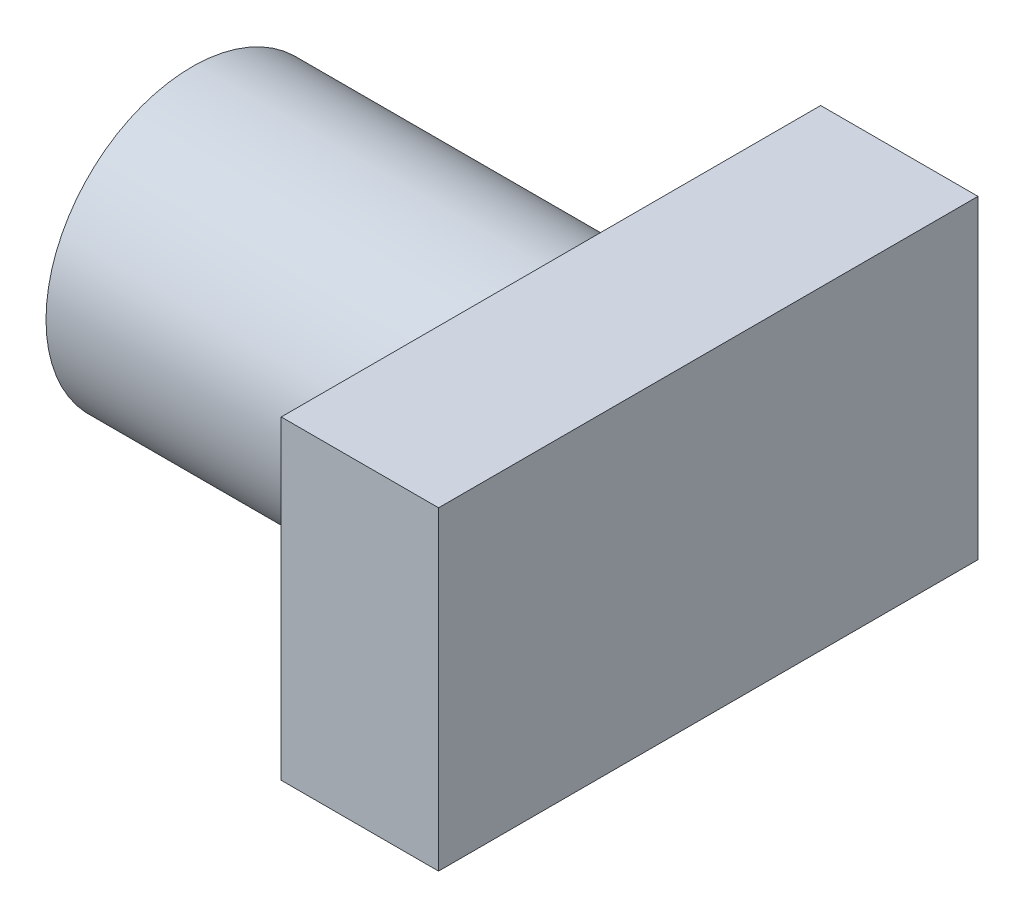
ISO-10303-21;
HEADER;
FILE_DESCRIPTION(('STEP AP214'),'2;1');
FILE_NAME('part.step','',(''),(''),'','','');
FILE_SCHEMA(('AUTOMOTIVE_DESIGN { 1 0 10303 214 1 1 1 1 }'));
ENDSEC;
DATA;
#1=APPLICATION_CONTEXT('core data for automotive mechanical design processes');
#2=APPLICATION_PROTOCOL_DEFINITION('international standard','automotive_design',2000,#1);
#3=PRODUCT_CONTEXT('',#1,'mechanical');
#4=PRODUCT('Part','Part','',(#3));
#5=PRODUCT_RELATED_PRODUCT_CATEGORY('part','',(#4));
#6=PRODUCT_DEFINITION_FORMATION('','',#4);
#7=PRODUCT_DEFINITION_CONTEXT('part definition',#1,'design');
#8=PRODUCT_DEFINITION('design','',#6,#7);
#9=PRODUCT_DEFINITION_SHAPE('','',#8);
#10=(LENGTH_UNIT() NAMED_UNIT(*) SI_UNIT(.MILLI.,.METRE.));
#11=(NAMED_UNIT(*) PLANE_ANGLE_UNIT() SI_UNIT($,.RADIAN.));
#12=(NAMED_UNIT(*) SI_UNIT($,.STERADIAN.) SOLID_ANGLE_UNIT());
#13=UNCERTAINTY_MEASURE_WITH_UNIT(LENGTH_MEASURE(1.E-05),#10,'distance_accuracy_value','');
#14=(GEOMETRIC_REPRESENTATION_CONTEXT(3) GLOBAL_UNCERTAINTY_ASSIGNED_CONTEXT((#13)) GLOBAL_UNIT_ASSIGNED_CONTEXT((#10,
#11,#12)) REPRESENTATION_CONTEXT('',''));
#15=CARTESIAN_POINT('',(0.,0.,0.));
#16=DIRECTION('',(0.,0.,1.));
#17=DIRECTION('',(1.,0.,0.));
#18=AXIS2_PLACEMENT_3D('',#15,#16,#17);
#19=CARTESIAN_POINT('',(0.,70.,0.));
#20=DIRECTION('',(0.,0.,-1.));
#21=DIRECTION('',(-1.,0.,0.));
#22=AXIS2_PLACEMENT_3D('',#19,#20,#21);
#23=PLANE('',#22);
#24=DIRECTION('',(1.,0.,0.));
#25=VECTOR('',#24,1.);
#26=CARTESIAN_POINT('',(0.,0.,0.));
#27=LINE('',#26,#25);
#28=CARTESIAN_POINT('',(0.,0.,0.));
#29=VERTEX_POINT('',#28);
#30=CARTESIAN_POINT('',(35.,0.,0.));
#31=VERTEX_POINT('',#30);
#32=EDGE_CURVE('E96',#29,#31,#27,.T.);
#33=ORIENTED_EDGE('',*,*,#32,.T.);
#34=DIRECTION('',(0.,-1.,0.));
#35=VECTOR('',#34,1.);
#36=CARTESIAN_POINT('',(35.,70.,0.));
#37=LINE('',#36,#35);
#38=CARTESIAN_POINT('',(35.,70.,0.));
#39=VERTEX_POINT('',#38);
#40=EDGE_CURVE('E11',#39,#31,#37,.T.);
#41=ORIENTED_EDGE('',*,*,#40,.F.);
#42=DIRECTION('',(1.,0.,0.));
#43=VECTOR('',#42,1.);
#44=CARTESIAN_POINT('',(0.,70.,0.));
#45=LINE('',#44,#43);
#46=CARTESIAN_POINT('',(0.,70.,0.));
#47=VERTEX_POINT('',#46);
#48=EDGE_CURVE('E82',#47,#39,#45,.T.);
#49=ORIENTED_EDGE('',*,*,#48,.F.);
#50=DIRECTION('',(0.,-1.,0.));
#51=VECTOR('',#50,1.);
#52=CARTESIAN_POINT('',(0.,70.,0.));
#53=LINE('',#52,#51);
#54=EDGE_CURVE('E49',#47,#29,#53,.T.);
#55=ORIENTED_EDGE('',*,*,#54,.T.);
#56=EDGE_LOOP('',(#33,#41,#49,#55));
#57=FACE_BOUND('',#56,.T.);
#58=ADVANCED_FACE('F33',(#57),#23,.F.);
#59=CARTESIAN_POINT('',(35.,70.,0.));
#60=DIRECTION('',(-1.,0.,0.));
#61=DIRECTION('',(0.,0.,1.));
#62=AXIS2_PLACEMENT_3D('',#59,#60,#61);
#63=PLANE('',#62);
#64=DIRECTION('',(0.,0.,-1.));
#65=VECTOR('',#64,1.);
#66=CARTESIAN_POINT('',(35.,0.,0.));
#67=LINE('',#66,#65);
#68=CARTESIAN_POINT('',(35.,0.,-120.));
#69=VERTEX_POINT('',#68);
#70=EDGE_CURVE('E87',#31,#69,#67,.T.);
#71=ORIENTED_EDGE('',*,*,#70,.T.);
#72=DIRECTION('',(0.,-1.,0.));
#73=VECTOR('',#72,1.);
#74=CARTESIAN_POINT('',(35.,70.,-120.));
#75=LINE('',#74,#73);
#76=CARTESIAN_POINT('',(35.,70.,-120.));
#77=VERTEX_POINT('',#76);
#78=EDGE_CURVE('E41',#77,#69,#75,.T.);
#79=ORIENTED_EDGE('',*,*,#78,.F.);
#80=DIRECTION('',(0.,0.,-1.));
#81=VECTOR('',#80,1.);
#82=CARTESIAN_POINT('',(35.,70.,0.));
#83=LINE('',#82,#81);
#84=EDGE_CURVE('E74',#39,#77,#83,.T.);
#85=ORIENTED_EDGE('',*,*,#84,.F.);
#86=ORIENTED_EDGE('',*,*,#40,.T.);
#87=EDGE_LOOP('',(#71,#79,#85,#86));
#88=FACE_BOUND('',#87,.T.);
#89=ADVANCED_FACE('F86',(#88),#63,.F.);
#90=CARTESIAN_POINT('',(0.,70.,-120.));
#91=DIRECTION('',(0.,0.,-1.));
#92=DIRECTION('',(-1.,0.,0.));
#93=AXIS2_PLACEMENT_3D('',#90,#91,#92);
#94=PLANE('',#93);
#95=DIRECTION('',(1.,0.,0.));
#96=VECTOR('',#95,1.);
#97=CARTESIAN_POINT('',(0.,0.,-120.));
#98=LINE('',#97,#96);
#99=CARTESIAN_POINT('',(0.,0.,-120.));
#100=VERTEX_POINT('',#99);
#101=EDGE_CURVE('E100',#100,#69,#98,.T.);
#102=ORIENTED_EDGE('',*,*,#101,.F.);
#103=DIRECTION('',(0.,-1.,0.));
#104=VECTOR('',#103,1.);
#105=CARTESIAN_POINT('',(0.,70.,-120.));
#106=LINE('',#105,#104);
#107=CARTESIAN_POINT('',(0.,70.,-120.));
#108=VERTEX_POINT('',#107);
#109=EDGE_CURVE('E63',#108,#100,#106,.T.);
#110=ORIENTED_EDGE('',*,*,#109,.F.);
#111=DIRECTION('',(1.,0.,0.));
#112=VECTOR('',#111,1.);
#113=CARTESIAN_POINT('',(0.,70.,-120.));
#114=LINE('',#113,#112);
#115=EDGE_CURVE('E81',#108,#77,#114,.T.);
#116=ORIENTED_EDGE('',*,*,#115,.T.);
#117=ORIENTED_EDGE('',*,*,#78,.T.);
#118=EDGE_LOOP('',(#102,#110,#116,#117));
#119=FACE_BOUND('',#118,.T.);
#120=ADVANCED_FACE('F90',(#119),#94,.T.);
#121=CARTESIAN_POINT('',(0.,70.,0.));
#122=DIRECTION('',(-1.,0.,0.));
#123=DIRECTION('',(0.,0.,1.));
#124=AXIS2_PLACEMENT_3D('',#121,#122,#123);
#125=PLANE('',#124);
#126=CARTESIAN_POINT('',(0.,34.8907926188389,-60.1749325689855));
#127=DIRECTION('',(-1.,0.,0.));
#128=DIRECTION('',(0.,0.,1.));
#129=AXIS2_PLACEMENT_3D('',#126,#127,#128);
#130=CIRCLE('',#129,32.5);
#131=CARTESIAN_POINT('',(0.,34.8907926188389,-27.6749325689855));
#132=VERTEX_POINT('',#131);
#133=EDGE_CURVE('E108',#132,#132,#130,.T.);
#134=ORIENTED_EDGE('',*,*,#133,.F.);
#135=EDGE_LOOP('',(#134));
#136=FACE_BOUND('',#135,.T.);
#137=DIRECTION('',(0.,0.,-1.));
#138=VECTOR('',#137,1.);
#139=CARTESIAN_POINT('',(0.,0.,0.));
#140=LINE('',#139,#138);
#141=EDGE_CURVE('E102',#29,#100,#140,.T.);
#142=ORIENTED_EDGE('',*,*,#141,.F.);
#143=ORIENTED_EDGE('',*,*,#54,.F.);
#144=DIRECTION('',(0.,0.,-1.));
#145=VECTOR('',#144,1.);
#146=CARTESIAN_POINT('',(0.,70.,0.));
#147=LINE('',#146,#145);
#148=EDGE_CURVE('E91',#47,#108,#147,.T.);
#149=ORIENTED_EDGE('',*,*,#148,.T.);
#150=ORIENTED_EDGE('',*,*,#109,.T.);
#151=EDGE_LOOP('',(#142,#143,#149,#150));
#152=FACE_BOUND('',#151,.T.);
#153=ADVANCED_FACE('F133',(#136,#152),#125,.T.);
#154=CARTESIAN_POINT('',(0.,70.,0.));
#155=DIRECTION('',(0.,1.,0.));
#156=DIRECTION('',(0.,0.,1.));
#157=AXIS2_PLACEMENT_3D('',#154,#155,#156);
#158=PLANE('',#157);
#159=ORIENTED_EDGE('',*,*,#48,.T.);
#160=ORIENTED_EDGE('',*,*,#84,.T.);
#161=ORIENTED_EDGE('',*,*,#115,.F.);
#162=ORIENTED_EDGE('',*,*,#148,.F.);
#163=EDGE_LOOP('',(#159,#160,#161,#162));
#164=FACE_BOUND('',#163,.T.);
#165=ADVANCED_FACE('F78',(#164),#158,.T.);
#166=CARTESIAN_POINT('',(0.,0.,0.));
#167=DIRECTION('',(0.,1.,0.));
#168=DIRECTION('',(0.,0.,1.));
#169=AXIS2_PLACEMENT_3D('',#166,#167,#168);
#170=PLANE('',#169);
#171=CARTESIAN_POINT('',(17.4328727175634,0.,-60.6234451885541));
#172=DIRECTION('',(0.,-1.,0.));
#173=DIRECTION('',(0.,0.,-1.));
#174=AXIS2_PLACEMENT_3D('',#171,#172,#173);
#175=CIRCLE('',#174,3.175);
#176=CARTESIAN_POINT('',(17.4328727175634,0.,-63.7984451885541));
#177=VERTEX_POINT('',#176);
#178=EDGE_CURVE('E114',#177,#177,#175,.T.);
#179=ORIENTED_EDGE('',*,*,#178,.F.);
#180=EDGE_LOOP('',(#179));
#181=FACE_BOUND('',#180,.T.);
#182=ORIENTED_EDGE('',*,*,#32,.F.);
#183=ORIENTED_EDGE('',*,*,#141,.T.);
#184=ORIENTED_EDGE('',*,*,#101,.T.);
#185=ORIENTED_EDGE('',*,*,#70,.F.);
#186=EDGE_LOOP('',(#182,#183,#184,#185));
#187=FACE_BOUND('',#186,.T.);
#188=ADVANCED_FACE('F129',(#181,#187),#170,.F.);
#189=CARTESIAN_POINT('',(-80.,34.8907926188389,-60.1749325689855));
#190=DIRECTION('',(1.,0.,0.));
#191=DIRECTION('',(0.,0.,-1.));
#192=AXIS2_PLACEMENT_3D('',#189,#190,#191);
#193=CYLINDRICAL_SURFACE('',#192,32.5);
#194=CARTESIAN_POINT('',(-80.,34.8907926188389,-60.1749325689855));
#195=DIRECTION('',(-1.,0.,0.));
#196=DIRECTION('',(0.,0.,1.));
#197=AXIS2_PLACEMENT_3D('',#194,#195,#196);
#198=CIRCLE('',#197,32.5);
#199=CARTESIAN_POINT('',(-80.,34.8907926188389,-27.6749325689855));
#200=VERTEX_POINT('',#199);
#201=EDGE_CURVE('E98',#200,#200,#198,.T.);
#202=ORIENTED_EDGE('',*,*,#201,.F.);
#203=EDGE_LOOP('',(#202));
#204=FACE_BOUND('',#203,.T.);
#205=ORIENTED_EDGE('',*,*,#133,.T.);
#206=EDGE_LOOP('',(#205));
#207=FACE_BOUND('',#206,.T.);
#208=ADVANCED_FACE('F131',(#204,#207),#193,.T.);
#209=CARTESIAN_POINT('',(-80.,34.8907926188389,-60.1749325689855));
#210=DIRECTION('',(-1.,0.,0.));
#211=DIRECTION('',(0.,0.,1.));
#212=AXIS2_PLACEMENT_3D('',#209,#210,#211);
#213=PLANE('',#212);
#214=ORIENTED_EDGE('',*,*,#201,.T.);
#215=EDGE_LOOP('',(#214));
#216=FACE_BOUND('',#215,.T.);
#217=ADVANCED_FACE('F125',(#216),#213,.T.);
#218=CARTESIAN_POINT('',(17.4328727175634,10.,-60.6234451885541));
#219=DIRECTION('',(0.,-1.,0.));
#220=DIRECTION('',(0.,0.,-1.));
#221=AXIS2_PLACEMENT_3D('',#218,#219,#220);
#222=CYLINDRICAL_SURFACE('',#221,3.175);
#223=CARTESIAN_POINT('',(17.4328727175634,10.,-60.6234451885541));
#224=DIRECTION('',(0.,-1.,0.));
#225=DIRECTION('',(0.,0.,-1.));
#226=AXIS2_PLACEMENT_3D('',#223,#224,#225);
#227=CIRCLE('',#226,3.175);
#228=CARTESIAN_POINT('',(17.4328727175634,10.,-63.7984451885541));
#229=VERTEX_POINT('',#228);
#230=EDGE_CURVE('E111',#229,#229,#227,.T.);
#231=ORIENTED_EDGE('',*,*,#230,.F.);
#232=EDGE_LOOP('',(#231));
#233=FACE_BOUND('',#232,.T.);
#234=ORIENTED_EDGE('',*,*,#178,.T.);
#235=EDGE_LOOP('',(#234));
#236=FACE_BOUND('',#235,.T.);
#237=ADVANCED_FACE('F122',(#233,#236),#222,.F.);
#238=CARTESIAN_POINT('',(17.4328727175634,10.,-60.6234451885541));
#239=DIRECTION('',(0.,-1.,0.));
#240=DIRECTION('',(0.,0.,-1.));
#241=AXIS2_PLACEMENT_3D('',#238,#239,#240);
#242=PLANE('',#241);
#243=ORIENTED_EDGE('',*,*,#230,.T.);
#244=EDGE_LOOP('',(#243));
#245=FACE_BOUND('',#244,.T.);
#246=ADVANCED_FACE('F120',(#245),#242,.T.);
#247=CLOSED_SHELL('',(#58,#89,#120,#153,#165,#188,#208,#217,#237,#246));
#248=MANIFOLD_SOLID_BREP('B2',#247);
#249=ADVANCED_BREP_SHAPE_REPRESENTATION('',(#18,#248),#14);
#250=SHAPE_DEFINITION_REPRESENTATION(#9,#249);
ENDSEC;
END-ISO-10303-21;
